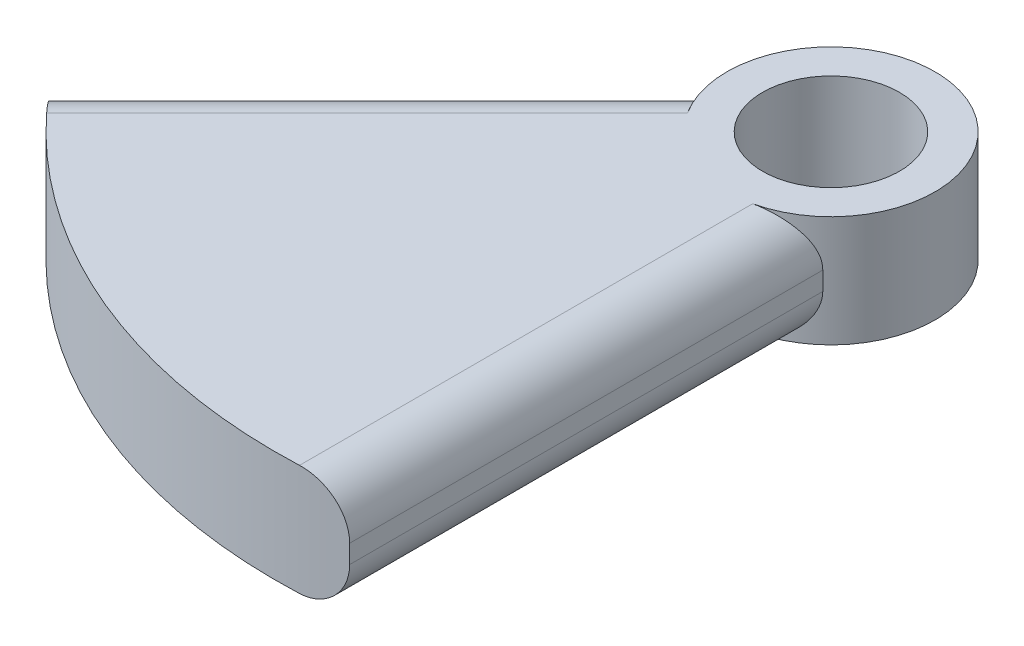
ISO-10303-21;
HEADER;
FILE_DESCRIPTION(('STEP AP214'),'2;1');
FILE_NAME('part.step','',(''),(''),'','','');
FILE_SCHEMA(('AUTOMOTIVE_DESIGN { 1 0 10303 214 1 1 1 1 }'));
ENDSEC;
DATA;
#1=APPLICATION_CONTEXT('core data for automotive mechanical design processes');
#2=APPLICATION_PROTOCOL_DEFINITION('international standard','automotive_design',2000,#1);
#3=PRODUCT_CONTEXT('',#1,'mechanical');
#4=PRODUCT('Part','Part','',(#3));
#5=PRODUCT_RELATED_PRODUCT_CATEGORY('part','',(#4));
#6=PRODUCT_DEFINITION_FORMATION('','',#4);
#7=PRODUCT_DEFINITION_CONTEXT('part definition',#1,'design');
#8=PRODUCT_DEFINITION('design','',#6,#7);
#9=PRODUCT_DEFINITION_SHAPE('','',#8);
#10=(LENGTH_UNIT() NAMED_UNIT(*) SI_UNIT(.MILLI.,.METRE.));
#11=(NAMED_UNIT(*) PLANE_ANGLE_UNIT() SI_UNIT($,.RADIAN.));
#12=(NAMED_UNIT(*) SI_UNIT($,.STERADIAN.) SOLID_ANGLE_UNIT());
#13=UNCERTAINTY_MEASURE_WITH_UNIT(LENGTH_MEASURE(1.E-05),#10,'distance_accuracy_value','');
#14=(GEOMETRIC_REPRESENTATION_CONTEXT(3) GLOBAL_UNCERTAINTY_ASSIGNED_CONTEXT((#13)) GLOBAL_UNIT_ASSIGNED_CONTEXT((#10,
#11,#12)) REPRESENTATION_CONTEXT('',''));
#15=CARTESIAN_POINT('',(0.,0.,0.));
#16=DIRECTION('',(0.,0.,1.));
#17=DIRECTION('',(1.,0.,0.));
#18=AXIS2_PLACEMENT_3D('',#15,#16,#17);
#19=CARTESIAN_POINT('',(-6.73519209080185,15.24,-6.73519209080187));
#20=DIRECTION('',(0.707106781186546,0.,0.707106781186548));
#21=DIRECTION('',(0.707106781186549,0.,-0.707106781186547));
#22=AXIS2_PLACEMENT_3D('',#19,#20,#21);
#23=PLANE('',#22);
#24=DIRECTION('',(0.,-1.,0.));
#25=VECTOR('',#24,1.);
#26=CARTESIAN_POINT('',(-60.1941220043346,15.24,46.7237378227307));
#27=LINE('',#26,#25);
#28=CARTESIAN_POINT('',(-60.1941220043346,8.89,46.7237378227307));
#29=VERTEX_POINT('',#28);
#30=CARTESIAN_POINT('',(-60.1941220043346,6.35,46.7237378227307));
#31=VERTEX_POINT('',#30);
#32=EDGE_CURVE('E159',#29,#31,#27,.T.);
#33=ORIENTED_EDGE('',*,*,#32,.F.);
#34=DIRECTION('',(-0.707106781186549,0.,0.707106781186547));
#35=VECTOR('',#34,1.);
#36=CARTESIAN_POINT('',(-14.2653657690778,8.89,0.794981587474069));
#37=LINE('',#36,#35);
#38=CARTESIAN_POINT('',(-14.2653657690778,8.89,0.794981587474068));
#39=VERTEX_POINT('',#38);
#40=EDGE_CURVE('E116',#29,#39,#37,.F.);
#41=ORIENTED_EDGE('',*,*,#40,.T.);
#42=DIRECTION('',(0.,-1.,0.));
#43=VECTOR('',#42,1.);
#44=CARTESIAN_POINT('',(-14.2653657690778,15.24,0.794981587474068));
#45=LINE('',#44,#43);
#46=CARTESIAN_POINT('',(-14.2653657690778,6.35,0.794981587474068));
#47=VERTEX_POINT('',#46);
#48=EDGE_CURVE('E148',#39,#47,#45,.T.);
#49=ORIENTED_EDGE('',*,*,#48,.T.);
#50=DIRECTION('',(-0.707106781186549,0.,0.707106781186547));
#51=VECTOR('',#50,1.);
#52=CARTESIAN_POINT('',(-6.73519209080185,6.35,-6.73519209080187));
#53=LINE('',#52,#51);
#54=EDGE_CURVE('E121',#47,#31,#53,.T.);
#55=ORIENTED_EDGE('',*,*,#54,.T.);
#56=EDGE_LOOP('',(#33,#41,#49,#55));
#57=FACE_BOUND('',#56,.T.);
#58=ADVANCED_FACE('F41',(#57),#23,.F.);
#59=CARTESIAN_POINT('',(1.31838984174237E-13,15.24,-3.12250225675825E-13));
#60=DIRECTION('',(0.,-1.,0.));
#61=DIRECTION('',(0.,0.,-1.));
#62=AXIS2_PLACEMENT_3D('',#59,#60,#61);
#63=CYLINDRICAL_SURFACE('',#62,76.2000000000003);
#64=CARTESIAN_POINT('',(1.31838984174237E-13,15.24,-3.12250225675825E-13));
#65=DIRECTION('',(0.,1.,0.));
#66=DIRECTION('',(0.,0.,1.));
#67=AXIS2_PLACEMENT_3D('',#64,#65,#66);
#68=CIRCLE('',#67,76.2000000000003);
#69=CARTESIAN_POINT('',(-56.0798082713242,15.24,51.5896802107894));
#70=VERTEX_POINT('',#69);
#71=CARTESIAN_POINT('',(3.17500000000001,15.24,76.1338254325894));
#72=VERTEX_POINT('',#71);
#73=EDGE_CURVE('E129',#70,#72,#68,.T.);
#74=ORIENTED_EDGE('',*,*,#73,.F.);
#75=CARTESIAN_POINT('',(-56.0798082713242,15.24,51.5896802107894));
#76=CARTESIAN_POINT('',(-56.2009597438312,15.2400193976228,51.4579936430628));
#77=CARTESIAN_POINT('',(-56.3216352153093,15.2324504076666,51.325875112836));
#78=CARTESIAN_POINT('',(-56.5611992358236,15.2022901159249,51.0617495608362));
#79=CARTESIAN_POINT('',(-56.6800879153672,15.1796999167964,50.9297425315904));
#80=CARTESIAN_POINT('',(-56.9151528714656,15.119679354057,50.6669172114474));
#81=CARTESIAN_POINT('',(-57.0313315514451,15.0822627140967,50.5360979353652));
#82=CARTESIAN_POINT('',(-57.2603155696502,14.9928753181606,50.276497499669));
#83=CARTESIAN_POINT('',(-57.3731209263728,14.9409046420053,50.1477163288814));
#84=CARTESIAN_POINT('',(-57.5946461849751,14.8227774714894,49.8931379529298));
#85=CARTESIAN_POINT('',(-57.703365367306,14.7566184922883,49.7673412747406));
#86=CARTESIAN_POINT('',(-57.9160515931682,14.6105701875254,49.5196690625934));
#87=CARTESIAN_POINT('',(-58.0200168712637,14.5306758127037,49.3977949902518));
#88=CARTESIAN_POINT('',(-58.2224849332517,14.3577676922412,49.15899459944));
#89=CARTESIAN_POINT('',(-58.3209893263322,14.2647578403441,49.0420668258501));
#90=CARTESIAN_POINT('',(-58.5119829263282,14.0662538475826,48.8140346426404));
#91=CARTESIAN_POINT('',(-58.6044719931194,13.9607594160564,48.7029303686883));
#92=CARTESIAN_POINT('',(-58.7831617320194,13.7376902716403,48.4871074367173));
#93=CARTESIAN_POINT('',(-58.8693426465704,13.6200801670563,48.3824089972888));
#94=CARTESIAN_POINT('',(-59.0346123742067,13.3738681908966,48.1806138968778));
#95=CARTESIAN_POINT('',(-59.1137011712569,13.2452662944698,48.0835172530829));
#96=CARTESIAN_POINT('',(-59.264353968903,12.9779443717861,47.8977103972579));
#97=CARTESIAN_POINT('',(-59.3359164812382,12.8392223535091,47.8090018442524));
#98=CARTESIAN_POINT('',(-59.4710969897202,12.5526589893363,47.6407417390397));
#99=CARTESIAN_POINT('',(-59.5347151864519,12.4048178738281,47.5611899556386));
#100=CARTESIAN_POINT('',(-59.6536429562678,12.101087464692,47.4119393138614));
#101=CARTESIAN_POINT('',(-59.7089544150165,11.9452000084463,47.3422382195499));
#102=CARTESIAN_POINT('',(-59.8109618778689,11.626510094817,47.2132989495842));
#103=CARTESIAN_POINT('',(-59.8576610710136,11.463710224618,47.1540569013918));
#104=CARTESIAN_POINT('',(-59.9421982803066,11.1323487409693,47.046546596674));
#105=CARTESIAN_POINT('',(-59.9800393593732,10.9637891422636,46.9982745471615));
#106=CARTESIAN_POINT('',(-60.0466629441145,10.6221361518407,46.9131237714516));
#107=CARTESIAN_POINT('',(-60.0754477276738,10.44904391208,46.8762421803123));
#108=CARTESIAN_POINT('',(-60.1310485276639,10.0471658377463,46.8049108038433));
#109=CARTESIAN_POINT('',(-60.1547048774195,9.81719629873169,46.7744823373798));
#110=CARTESIAN_POINT('',(-60.1783550206107,9.47038123575287,46.7440447959659));
#111=CARTESIAN_POINT('',(-60.1842660026311,9.35451977757818,46.7364331524534));
#112=CARTESIAN_POINT('',(-60.192148850775,9.12244833652524,46.7262799851714));
#113=CARTESIAN_POINT('',(-60.1941209580183,9.00623837541692,46.7237381510514));
#114=CARTESIAN_POINT('',(-60.1941220043346,8.89,46.7237378227307));
#115=B_SPLINE_CURVE_WITH_KNOTS('',3,(#75,#76,#77,#78,#79,#80,#81,#82,#83,#84,#85,#86,#87,#88,
#89,#90,#91,#92,#93,#94,#95,#96,#97,#98,#99,#100,#101,#102,#103,#104,#105,#106,#107,#108,#109,
#110,#111,#112,#113,#114),.UNSPECIFIED.,.F.,.F.,(4,2,2,2,2,2,2,2,2,2,2,2,2,2,2,2,2,2,2,4),(0.,
0.536648447546683,1.07325750586902,1.60937102402484,2.14548160196476,2.68168614736492,
3.2180882297084,3.75433139811692,4.29058705361406,4.82845617505523,5.36632651257956,
5.90430301034748,6.44226592208945,6.98010652880154,7.51774757654733,8.05520244571623,
8.59252202328639,9.29043338687929,9.63906867957098,9.98768262975453),.UNSPECIFIED.);
#116=EDGE_CURVE('E111',#70,#29,#115,.T.);
#117=ORIENTED_EDGE('',*,*,#116,.T.);
#118=ORIENTED_EDGE('',*,*,#32,.T.);
#119=CARTESIAN_POINT('',(-60.1941220043346,6.35,46.7237378227307));
#120=CARTESIAN_POINT('',(-60.1941309841204,6.1722269928493,46.7237185725701));
#121=CARTESIAN_POINT('',(-60.1895087033319,5.99445761005288,46.7296808932899));
#122=CARTESIAN_POINT('',(-60.1710668079349,5.6402026611297,46.7534291461566));
#123=CARTESIAN_POINT('',(-60.1572478624997,5.46371700254029,46.7712142180494));
#124=CARTESIAN_POINT('',(-60.1204971179359,5.11346387167723,46.8184436642978));
#125=CARTESIAN_POINT('',(-60.0975749055403,4.93969373911274,46.847875772938));
#126=CARTESIAN_POINT('',(-60.042744496835,4.59591618282648,46.9181290150811));
#127=CARTESIAN_POINT('',(-60.0108363640886,4.42590873249798,46.9589500680225));
#128=CARTESIAN_POINT('',(-59.9381992537539,4.09082602670727,47.0516283492346));
#129=CARTESIAN_POINT('',(-59.8974687279105,3.92575164275,47.1034875145725));
#130=CARTESIAN_POINT('',(-59.8073935656179,3.60166425231403,47.2178035245652));
#131=CARTESIAN_POINT('',(-59.7580457601304,3.44265350206283,47.280264267754));
#132=CARTESIAN_POINT('',(-59.651036587918,3.13193475370993,47.415200527569));
#133=CARTESIAN_POINT('',(-59.5933788956521,2.9802235672349,47.4876716172419));
#134=CARTESIAN_POINT('',(-59.470024461757,2.68502754353546,47.6420607536229));
#135=CARTESIAN_POINT('',(-59.4043249147594,2.54154560283035,47.7239820964364));
#136=CARTESIAN_POINT('',(-59.2649570377709,2.26324784415406,47.8969440707208));
#137=CARTESIAN_POINT('',(-59.1912551831422,2.12847257779568,47.9880229387115));
#138=CARTESIAN_POINT('',(-59.0365282557148,1.86920959105832,48.1782456960806));
#139=CARTESIAN_POINT('',(-58.9555031472723,1.74472192075696,48.2773896247131));
#140=CARTESIAN_POINT('',(-58.7865536647992,1.50685177165547,48.4829744594069));
#141=CARTESIAN_POINT('',(-58.6986266834575,1.3934735263656,48.5894181211413));
#142=CARTESIAN_POINT('',(-58.5164358300035,1.17870070479452,48.8086779586693));
#143=CARTESIAN_POINT('',(-58.4221741385495,1.07730203748338,48.9214919394318));
#144=CARTESIAN_POINT('',(-58.2272659789797,0.886591435248749,49.1533168596973));
#145=CARTESIAN_POINT('',(-58.1265852398657,0.797354044784899,49.2723603253524));
#146=CARTESIAN_POINT('',(-57.9199919189212,0.632339953171678,49.515047423479));
#147=CARTESIAN_POINT('',(-57.8140812419092,0.556558396760419,49.6386893771238));
#148=CARTESIAN_POINT('',(-57.5976800873388,0.418980948424143,49.8896249221973));
#149=CARTESIAN_POINT('',(-57.4871909970662,0.357180856170985,50.0169174039467));
#150=CARTESIAN_POINT('',(-57.2623604217276,0.248003272396951,50.2741612081216));
#151=CARTESIAN_POINT('',(-57.1480198581088,0.200622357995364,50.4041118917034));
#152=CARTESIAN_POINT('',(-56.8775753764002,0.107300398566586,50.7093241185317));
#153=CARTESIAN_POINT('',(-56.7202267639635,0.0670769018500863,50.8852839942108));
#154=CARTESIAN_POINT('',(-56.4816360749163,0.0268426948454709,51.1495739849643));
#155=CARTESIAN_POINT('',(-56.4017130074763,0.0167814776547031,51.2376908221128));
#156=CARTESIAN_POINT('',(-56.2412054543675,0.00336097116954585,51.413821199862));
#157=CARTESIAN_POINT('',(-56.1606210149728,1.21694275432921E-06,51.5018347472053));
#158=CARTESIAN_POINT('',(-56.0798082713242,0.,51.5896802107894));
#159=B_SPLINE_CURVE_WITH_KNOTS('',3,(#119,#120,#121,#122,#123,#124,#125,#126,#127,#128,#129,
#130,#131,#132,#133,#134,#135,#136,#137,#138,#139,#140,#141,#142,#143,#144,#145,#146,#147,#148,
#149,#150,#151,#152,#153,#154,#155,#156,#157,#158),.UNSPECIFIED.,.F.,.F.,(4,2,2,2,2,2,2,2,2,2,2,
2,2,2,2,2,2,2,2,4),(0.,0.533153742174724,1.06626869494094,1.59882370199253,2.13137494202839,
2.66401971612176,3.1968607865339,3.72946696448159,4.26225947229214,4.79737709262034,
5.33249731762328,5.86782067624079,6.40296069005885,6.9412460647689,7.47933681377719,
8.01726569362283,8.55506677802506,9.27169546398057,9.6297002406941,9.98768017897878),.UNSPECIFIED.);
#160=CARTESIAN_POINT('',(-56.0798082713242,0.,51.5896802107894));
#161=VERTEX_POINT('',#160);
#162=EDGE_CURVE('E122',#31,#161,#159,.T.);
#163=ORIENTED_EDGE('',*,*,#162,.T.);
#164=CARTESIAN_POINT('',(1.31838984174237E-13,0.,-3.12250225675825E-13));
#165=DIRECTION('',(0.,1.,0.));
#166=DIRECTION('',(0.,0.,1.));
#167=AXIS2_PLACEMENT_3D('',#164,#165,#166);
#168=CIRCLE('',#167,76.2000000000003);
#169=CARTESIAN_POINT('',(3.17500000000001,0.,76.1338254325894));
#170=VERTEX_POINT('',#169);
#171=EDGE_CURVE('E149',#161,#170,#168,.T.);
#172=ORIENTED_EDGE('',*,*,#171,.T.);
#173=CARTESIAN_POINT('',(3.17500000000001,0.,76.1338254325894));
#174=CARTESIAN_POINT('',(3.35378349279112,-1.93976228121325E-05,76.1263759953192));
#175=CARTESIAN_POINT('',(3.53253584563996,0.0075495923334187,76.1182845308805));
#176=CARTESIAN_POINT('',(3.88869815797765,0.0377098840750796,76.1009169054107));
#177=CARTESIAN_POINT('',(4.06610821503325,0.0603000832036467,76.0916408313783));
#178=CARTESIAN_POINT('',(4.41816980565035,0.120320645943,76.0720112897142));
#179=CARTESIAN_POINT('',(4.59282373532083,0.15773728590327,76.0616588249294));
#180=CARTESIAN_POINT('',(4.93830511585674,0.247124681839386,76.0400097485058));
#181=CARTESIAN_POINT('',(5.10913258770253,0.299095357994736,76.0287131420454));
#182=CARTESIAN_POINT('',(5.44578869624316,0.417222528510574,76.0053410586284));
#183=CARTESIAN_POINT('',(5.61161645151271,0.483381507711677,75.9932654455013));
#184=CARTESIAN_POINT('',(5.93713902480562,0.62942981247458,75.9685266173527));
#185=CARTESIAN_POINT('',(6.09683156095847,0.70932418729628,75.9558631874984));
#186=CARTESIAN_POINT('',(6.40885547625688,0.882232307758812,75.9301723514108));
#187=CARTESIAN_POINT('',(6.56118902219522,0.975242159655917,75.9171450541202));
#188=CARTESIAN_POINT('',(6.857484994992,1.17374615241742,75.8909548207643));
#189=CARTESIAN_POINT('',(7.00144722683593,1.27924058394357,75.8777918815476));
#190=CARTESIAN_POINT('',(7.28040981167289,1.5023097283597,75.8515347489199));
#191=CARTESIAN_POINT('',(7.41538189726025,1.61991983294368,75.8384408815083));
#192=CARTESIAN_POINT('',(7.67493592630761,1.86613180910342,75.812613542734));
#193=CARTESIAN_POINT('',(7.79951784627555,1.99473370553016,75.7998800721861));
#194=CARTESIAN_POINT('',(8.03743074884067,2.26205562821386,75.7750223992617));
#195=CARTESIAN_POINT('',(8.15075950597097,2.40077764649094,75.7628983176332));
#196=CARTESIAN_POINT('',(8.36532442160199,2.68734101066366,75.739507510466));
#197=CARTESIAN_POINT('',(8.46656088541619,2.83518212617189,75.7282407632834));
#198=CARTESIAN_POINT('',(8.65619165882157,3.13891253530803,75.7067992548945));
#199=CARTESIAN_POINT('',(8.74458888282385,3.29479999155367,75.6966242460093));
#200=CARTESIAN_POINT('',(8.90789288369236,3.61348990518299,75.6775805825699));
#201=CARTESIAN_POINT('',(8.98280465384914,3.77628977538198,75.6687114447102));
#202=CARTESIAN_POINT('',(9.11860275331625,4.10765125903071,75.6524670131505));
#203=CARTESIAN_POINT('',(9.17949393048366,4.27621085773642,75.6450912032139));
#204=CARTESIAN_POINT('',(9.28681460996899,4.61786384815934,75.6319905008436));
#205=CARTESIAN_POINT('',(9.33324774881435,4.79095608792002,75.6262651932979));
#206=CARTESIAN_POINT('',(9.4230023515393,5.19283416225367,75.6151419959976));
#207=CARTESIAN_POINT('',(9.46124609184705,5.42280370126831,75.6103533863505));
#208=CARTESIAN_POINT('',(9.49949186041001,5.76961876424713,75.6055539710405));
#209=CARTESIAN_POINT('',(9.50905380062382,5.88548022242182,75.604351421767));
#210=CARTESIAN_POINT('',(9.52180718943703,6.11755166347476,75.602746063709));
#211=CARTESIAN_POINT('',(9.52499902798485,6.23376162458309,75.6023432059711));
#212=CARTESIAN_POINT('',(9.52500000000001,6.35,75.6023437136707));
#213=B_SPLINE_CURVE_WITH_KNOTS('',3,(#173,#174,#175,#176,#177,#178,#179,#180,#181,#182,#183,
#184,#185,#186,#187,#188,#189,#190,#191,#192,#193,#194,#195,#196,#197,#198,#199,#200,#201,#202,
#203,#204,#205,#206,#207,#208,#209,#210,#211,#212),.UNSPECIFIED.,.F.,.F.,(4,2,2,2,2,2,2,2,2,2,2,
2,2,2,2,2,2,2,2,4),(0.,0.536648447546683,1.07325750586901,1.60937102402484,2.14548160196476,
2.68168614736491,3.21808822970839,3.75433139811691,4.29058705361405,4.82845617505523,
5.36632651257956,5.90430301034748,6.44226592208946,6.98010652880154,7.51774757654733,
8.05520244571623,8.59252202328639,9.29043338687929,9.63906867957098,9.98768262975453),.UNSPECIFIED.);
#214=CARTESIAN_POINT('',(9.52500000000001,6.35,75.6023437136707));
#215=VERTEX_POINT('',#214);
#216=EDGE_CURVE('E168',#170,#215,#213,.T.);
#217=ORIENTED_EDGE('',*,*,#216,.T.);
#218=DIRECTION('',(0.,-1.,0.));
#219=VECTOR('',#218,1.);
#220=CARTESIAN_POINT('',(9.52500000000001,15.24,75.6023437136707));
#221=LINE('',#220,#219);
#222=CARTESIAN_POINT('',(9.52500000000001,8.89,75.6023437136707));
#223=VERTEX_POINT('',#222);
#224=EDGE_CURVE('E157',#223,#215,#221,.T.);
#225=ORIENTED_EDGE('',*,*,#224,.F.);
#226=CARTESIAN_POINT('',(9.52500000000001,8.89,75.6023437136707));
#227=CARTESIAN_POINT('',(9.52501996158658,9.0677730071507,75.602336451419));
#228=CARTESIAN_POINT('',(9.51753551808388,9.24554238994712,75.6032840027414));
#229=CARTESIAN_POINT('',(9.48770257814736,9.5997973388703,75.6070361640917));
#230=CARTESIAN_POINT('',(9.46535516318198,9.77628299745971,75.6098406390049));
#231=CARTESIAN_POINT('',(9.40597220077333,10.1265361283228,75.6172502000242));
#232=CARTESIAN_POINT('',(9.3689521053445,10.3003062608873,75.6218533918035));
#233=CARTESIAN_POINT('',(9.28050460761402,10.6440838171735,75.6327589819125));
#234=CARTESIAN_POINT('',(9.22907730722397,10.814091267502,75.6390613682225));
#235=CARTESIAN_POINT('',(9.1121816728268,11.1491739732927,75.6532326160528));
#236=CARTESIAN_POINT('',(9.04671087432442,11.31424835725,75.6611017525048));
#237=CARTESIAN_POINT('',(8.90218449038687,11.638335747686,75.6782426202952));
#238=CARTESIAN_POINT('',(8.82312390742323,11.7973464979372,75.6875148674652));
#239=CARTESIAN_POINT('',(8.65204265175956,12.1080652462901,75.7072623004877));
#240=CARTESIAN_POINT('',(8.56002770762313,12.2597764327651,75.7177369542465));
#241=CARTESIAN_POINT('',(8.36363334564987,12.5549724564645,75.7396818028265));
#242=CARTESIAN_POINT('',(8.2592496134197,12.6984543971696,75.751152344651));
#243=CARTESIAN_POINT('',(8.03839905761764,12.9767521558459,75.7749069586567));
#244=CARTESIAN_POINT('',(7.9218814912446,13.1115274222043,75.7871943626417));
#245=CARTESIAN_POINT('',(7.6779652299569,13.3707904089417,75.8122937046973));
#246=CARTESIAN_POINT('',(7.55056648208132,13.495278079243,75.8251056453208));
#247=CARTESIAN_POINT('',(7.28573072662546,13.7331482283445,75.8510107513072));
#248=CARTESIAN_POINT('',(7.14828992684273,13.8465264736344,75.8641040215779));
#249=CARTESIAN_POINT('',(6.86442142093742,14.0612992952055,75.8903157515883));
#250=CARTESIAN_POINT('',(6.71799680889437,14.1626979625166,75.9034342011649));
#251=CARTESIAN_POINT('',(6.4162509543862,14.3534085647512,75.9295382929923));
#252=CARTESIAN_POINT('',(6.26088247920309,14.4426459552151,75.9425227014506));
#253=CARTESIAN_POINT('',(5.94319324822361,14.6076600468283,75.9680448560547));
#254=CARTESIAN_POINT('',(5.780875026447,14.6834416032396,75.9805827620009));
#255=CARTESIAN_POINT('',(5.45041807703146,14.8210190515759,76.0050022637097));
#256=CARTESIAN_POINT('',(5.28228111501344,14.882819143829,76.0168840557699));
#257=CARTESIAN_POINT('',(4.94140305222326,14.991996727603,76.0398036696802));
#258=CARTESIAN_POINT('',(4.76866305474311,15.0393776420046,76.0508416913612));
#259=CARTESIAN_POINT('',(4.36161229250113,15.1326996014334,76.0754261997019));
#260=CARTESIAN_POINT('',(4.12592760032748,15.1729230981499,76.0885863501471));
#261=CARTESIAN_POINT('',(3.77033726151268,15.2131573051545,76.1067585006554));
#262=CARTESIAN_POINT('',(3.65151510546822,15.2232185223453,76.1125523707797));
#263=CARTESIAN_POINT('',(3.41347614175392,15.2366390288305,76.1235993760242));
#264=CARTESIAN_POINT('',(3.29425936203705,15.2399987830572,76.1288525486328));
#265=CARTESIAN_POINT('',(3.17500000000001,15.24,76.1338254325894));
#266=B_SPLINE_CURVE_WITH_KNOTS('',3,(#226,#227,#228,#229,#230,#231,#232,#233,#234,#235,#236,
#237,#238,#239,#240,#241,#242,#243,#244,#245,#246,#247,#248,#249,#250,#251,#252,#253,#254,#255,
#256,#257,#258,#259,#260,#261,#262,#263,#264,#265),.UNSPECIFIED.,.F.,.F.,(4,2,2,2,2,2,2,2,2,2,2,
2,2,2,2,2,2,2,2,4),(0.,0.533153742174724,1.06626869494094,1.59882370199254,2.13137494202839,
2.66401971612176,3.1968607865339,3.72946696448159,4.26225947229214,4.79737709262035,
5.33249731762329,5.86782067624079,6.40296069005884,6.94124606476891,7.47933681377719,
8.01726569362282,8.55506677802505,9.27169546398055,9.62970024069408,9.98768017897878),.UNSPECIFIED.);
#267=EDGE_CURVE('E133',#223,#72,#266,.T.);
#268=ORIENTED_EDGE('',*,*,#267,.T.);
#269=EDGE_LOOP('',(#74,#117,#118,#163,#172,#217,#225,#268));
#270=FACE_BOUND('',#269,.T.);
#271=ADVANCED_FACE('F136',(#270),#63,.T.);
#272=CARTESIAN_POINT('',(9.525,15.24,0.));
#273=DIRECTION('',(1.,0.,0.));
#274=DIRECTION('',(0.,0.,-1.));
#275=AXIS2_PLACEMENT_3D('',#272,#273,#274);
#276=PLANE('',#275);
#277=ORIENTED_EDGE('',*,*,#224,.T.);
#278=DIRECTION('',(0.,0.,1.));
#279=VECTOR('',#278,1.);
#280=CARTESIAN_POINT('',(9.525,6.35,10.6492737428427));
#281=LINE('',#280,#279);
#282=CARTESIAN_POINT('',(9.525,6.35,10.6492737428427));
#283=VERTEX_POINT('',#282);
#284=EDGE_CURVE('E62',#215,#283,#281,.F.);
#285=ORIENTED_EDGE('',*,*,#284,.T.);
#286=DIRECTION('',(0.,-1.,0.));
#287=VECTOR('',#286,1.);
#288=CARTESIAN_POINT('',(9.525,15.24,10.6492737428427));
#289=LINE('',#288,#287);
#290=CARTESIAN_POINT('',(9.525,8.89,10.6492737428427));
#291=VERTEX_POINT('',#290);
#292=EDGE_CURVE('E155',#291,#283,#289,.T.);
#293=ORIENTED_EDGE('',*,*,#292,.F.);
#294=DIRECTION('',(0.,0.,1.));
#295=VECTOR('',#294,1.);
#296=CARTESIAN_POINT('',(9.525,8.89,0.));
#297=LINE('',#296,#295);
#298=EDGE_CURVE('E252',#291,#223,#297,.T.);
#299=ORIENTED_EDGE('',*,*,#298,.T.);
#300=EDGE_LOOP('',(#277,#285,#293,#299));
#301=FACE_BOUND('',#300,.T.);
#302=ADVANCED_FACE('F178',(#301),#276,.T.);
#303=CARTESIAN_POINT('',(0.,15.24,0.));
#304=DIRECTION('',(0.,-1.,0.));
#305=DIRECTION('',(0.,0.,-1.));
#306=AXIS2_PLACEMENT_3D('',#303,#304,#305);
#307=CYLINDRICAL_SURFACE('',#306,14.2875);
#308=CARTESIAN_POINT('',(0.,0.,0.));
#309=DIRECTION('',(0.,1.,0.));
#310=DIRECTION('',(0.,0.,1.));
#311=AXIS2_PLACEMENT_3D('',#308,#309,#310);
#312=CIRCLE('',#311,14.2875);
#313=CARTESIAN_POINT('',(3.175,0.,13.930255964985));
#314=VERTEX_POINT('',#313);
#315=CARTESIAN_POINT('',(-12.0952424867725,0.,7.60511442623794));
#316=VERTEX_POINT('',#315);
#317=EDGE_CURVE('E143',#314,#316,#312,.T.);
#318=ORIENTED_EDGE('',*,*,#317,.T.);
#319=CARTESIAN_POINT('',(-12.0952424867725,0.,7.60511442623794));
#320=CARTESIAN_POINT('',(-12.1946052914386,-2.43342902689872E-05,7.44715150664379));
#321=CARTESIAN_POINT('',(-12.2907884986666,0.00781876892634857,7.28725011988895));
#322=CARTESIAN_POINT('',(-12.4761851381713,0.0386141698449891,6.96503539134375));
#323=CARTESIAN_POINT('',(-12.5654037892139,0.0615550303466238,6.8027239661651));
#324=CARTESIAN_POINT('',(-12.7359235200099,0.121749398279241,6.47784309942922));
#325=CARTESIAN_POINT('',(-12.8172669797964,0.158920264344715,6.31528044755178));
#326=CARTESIAN_POINT('',(-12.9723764461622,0.246876876566653,5.99020275945633));
#327=CARTESIAN_POINT('',(-13.0461411473007,0.297664962868458,5.82768773623355));
#328=CARTESIAN_POINT('',(-13.1857817121705,0.411944778020086,5.50442805650823));
#329=CARTESIAN_POINT('',(-13.2516817258289,0.475395930278238,5.34367943268905));
#330=CARTESIAN_POINT('',(-13.375976862605,0.614427383343733,5.024465199064));
#331=CARTESIAN_POINT('',(-13.4343687493847,0.6900128832423,4.86600059973202));
#332=CARTESIAN_POINT('',(-13.5439159561101,0.852774109928859,4.55221469971493));
#333=CARTESIAN_POINT('',(-13.5950594217318,0.939968380662649,4.39689889613785));
#334=CARTESIAN_POINT('',(-13.6903134171668,1.12527683098266,4.09068344767942));
#335=CARTESIAN_POINT('',(-13.7344233954362,1.22339186591745,3.93978414988334));
#336=CARTESIAN_POINT('',(-13.8202372971594,1.44079204358634,3.62801294916496));
#337=CARTESIAN_POINT('',(-13.8612145712966,1.56121762061923,3.46773477621532));
#338=CARTESIAN_POINT('',(-13.9356762878939,1.8142426171498,3.15521649676144));
#339=CARTESIAN_POINT('',(-13.9691597308522,1.9468436572475,3.00297746455723));
#340=CARTESIAN_POINT('',(-14.0293015321684,2.22375857378736,2.7081338024094));
#341=CARTESIAN_POINT('',(-14.055960789126,2.36807090480328,2.56552790580987));
#342=CARTESIAN_POINT('',(-14.1031985779868,2.66809363209332,2.29166971596494));
#343=CARTESIAN_POINT('',(-14.1237764492099,2.82380526449353,2.16041865740096));
#344=CARTESIAN_POINT('',(-14.1561925818853,3.11528173255267,1.93525633173783));
#345=CARTESIAN_POINT('',(-14.1689500740666,3.24914525934929,1.83901129829899));
#346=CARTESIAN_POINT('',(-14.1914405893298,3.52379988354507,1.65653821819643));
#347=CARTESIAN_POINT('',(-14.2011737296232,3.66459071222531,1.57030978341144));
#348=CARTESIAN_POINT('',(-14.2180328887893,3.95225155553298,1.40950903974866));
#349=CARTESIAN_POINT('',(-14.2251672219627,4.09910047969669,1.33490000369192));
#350=CARTESIAN_POINT('',(-14.2373080890206,4.39866286982922,1.19850169626476));
#351=CARTESIAN_POINT('',(-14.2423158053083,4.55137302530253,1.13670531084302));
#352=CARTESIAN_POINT('',(-14.2499767610254,4.83778525637921,1.03584167073339));
#353=CARTESIAN_POINT('',(-14.2528746612084,4.97076376085096,0.994735937737754));
#354=CARTESIAN_POINT('',(-14.2576661511125,5.23963024198321,0.923515254764918));
#355=CARTESIAN_POINT('',(-14.2595600136785,5.37551741776571,0.893397319574514));
#356=CARTESIAN_POINT('',(-14.2625349429093,5.65054204328898,0.844625972947048));
#357=CARTESIAN_POINT('',(-14.2636089952548,5.78969726751953,0.826071742674611));
#358=CARTESIAN_POINT('',(-14.2650179562505,6.06922562866961,0.801217117051879));
#359=CARTESIAN_POINT('',(-14.2653521872704,6.20959976401383,0.79492795636834));
#360=CARTESIAN_POINT('',(-14.2653657690778,6.35,0.794981587474073));
#361=B_SPLINE_CURVE_WITH_KNOTS('',3,(#319,#320,#321,#322,#323,#324,#325,#326,#327,#328,#329,
#330,#331,#332,#333,#334,#335,#336,#337,#338,#339,#340,#341,#342,#343,#344,#345,#346,#347,#348,
#349,#350,#351,#352,#353,#354,#355,#356,#357,#358,#359,#360),.UNSPECIFIED.,.F.,.F.,(4,2,2,2,2,2,
2,2,2,2,2,2,2,2,2,2,2,2,2,2,4),(0.,0.559568202411894,1.11871299503346,1.67465861869861,
2.23069984398764,2.7849871411645,3.33951256564101,3.89493466659928,4.45040030061385,
5.06360203014562,5.67688549778403,6.29008816750002,6.90335743092969,7.39901855720459,
7.89466047128452,8.38870246650906,8.88246941262195,9.29968571910928,9.71678858987569,
10.1374213946519,10.5584393137445),.UNSPECIFIED.);
#362=EDGE_CURVE('E202',#316,#47,#361,.T.);
#363=ORIENTED_EDGE('',*,*,#362,.T.);
#364=ORIENTED_EDGE('',*,*,#48,.F.);
#365=CARTESIAN_POINT('',(-14.2653657690778,8.89,0.794981587474069));
#366=CARTESIAN_POINT('',(-14.265346644756,9.04329224609793,0.794907667415692));
#367=CARTESIAN_POINT('',(-14.2649511660111,9.19654200099966,0.802414768056198));
#368=CARTESIAN_POINT('',(-14.2632674136647,9.50145626175112,0.832017635800966));
#369=CARTESIAN_POINT('',(-14.2619801292766,9.65312233523615,0.854097237435928));
#370=CARTESIAN_POINT('',(-14.2583899391984,9.9523243902734,0.912005030961723));
#371=CARTESIAN_POINT('',(-14.2560965364668,10.0998855961046,0.947704182112406));
#372=CARTESIAN_POINT('',(-14.2502501446558,10.3912708367543,1.03189779425558));
#373=CARTESIAN_POINT('',(-14.2466968700186,10.5350940163874,1.08039515540417));
#374=CARTESIAN_POINT('',(-14.2337427786835,10.9583927550829,1.24298865539872));
#375=CARTESIAN_POINT('',(-14.2220351128158,11.2312466549553,1.37450421166789));
#376=CARTESIAN_POINT('',(-14.1897632587451,11.7551659298761,1.67514133979174));
#377=CARTESIAN_POINT('',(-14.1691769969827,12.006175113995,1.84435612750272));
#378=CARTESIAN_POINT('',(-14.1128478715978,12.5164162674823,2.23710373475809));
#379=CARTESIAN_POINT('',(-14.0754337789981,12.7721819804847,2.46488579384515));
#380=CARTESIAN_POINT('',(-13.9819595619365,13.2511030492092,2.94929040342515));
#381=CARTESIAN_POINT('',(-13.925888114585,13.4742384834055,3.205930404631));
#382=CARTESIAN_POINT('',(-13.8183814641402,13.8044370979752,3.6349602026201));
#383=CARTESIAN_POINT('',(-13.7738307239646,13.9225837605973,3.80068441662386));
#384=CARTESIAN_POINT('',(-13.6761094552708,14.1455060835148,4.13854786031776));
#385=CARTESIAN_POINT('',(-13.6229377858755,14.2502799707988,4.31068793674547));
#386=CARTESIAN_POINT('',(-13.5075498601544,14.4455311146022,4.65966685657425));
#387=CARTESIAN_POINT('',(-13.4453451146125,14.5360262646897,4.83649948935647));
#388=CARTESIAN_POINT('',(-13.3114753954458,14.701994986879,5.19361422855684));
#389=CARTESIAN_POINT('',(-13.239810998141,14.7774694733983,5.37389612426033));
#390=CARTESIAN_POINT('',(-13.0912469944305,14.9085280187187,5.72592993767542));
#391=CARTESIAN_POINT('',(-13.0148860446768,14.9650068146577,5.89757564548445));
#392=CARTESIAN_POINT('',(-12.8536675049544,15.0628813608722,6.24114596121989));
#393=CARTESIAN_POINT('',(-12.7688119813074,15.1042807679279,6.41307049135993));
#394=CARTESIAN_POINT('',(-12.5903782229891,15.171340176607,6.75667123677476));
#395=CARTESIAN_POINT('',(-12.4967564129802,15.1969161575398,6.92834137823347));
#396=CARTESIAN_POINT('',(-12.3016959178163,15.2312686828327,7.26910161832616));
#397=CARTESIAN_POINT('',(-12.2002500246579,15.2400295390891,7.43818916172635));
#398=CARTESIAN_POINT('',(-12.0952424867725,15.24,7.60511442623793));
#399=B_SPLINE_CURVE_WITH_KNOTS('',3,(#365,#366,#367,#368,#369,#370,#371,#372,#373,#374,#375,
#376,#377,#378,#379,#380,#381,#382,#383,#384,#385,#386,#387,#388,#389,#390,#391,#392,#393,#394,
#395,#396,#397,#398),.UNSPECIFIED.,.F.,.F.,(4,2,2,2,2,2,2,2,2,2,2,2,2,2,2,2,4),(0.,
0.459623837942286,0.918738664093942,1.37360742093726,1.82857934258849,2.73384045160397,
3.64136527175216,4.67143169469631,5.70212439430992,6.32654605678423,6.95105042156087,
7.57476585684126,8.19844331039135,8.78622730755319,9.37386867093775,9.96460415210627,
10.5558905077598),.UNSPECIFIED.);
#400=CARTESIAN_POINT('',(-12.0952424867725,15.24,7.60511442623793));
#401=VERTEX_POINT('',#400);
#402=EDGE_CURVE('E208',#39,#401,#399,.T.);
#403=ORIENTED_EDGE('',*,*,#402,.T.);
#404=CARTESIAN_POINT('',(0.,15.24,0.));
#405=DIRECTION('',(0.,1.,0.));
#406=DIRECTION('',(0.,0.,1.));
#407=AXIS2_PLACEMENT_3D('',#404,#405,#406);
#408=CIRCLE('',#407,14.2875);
#409=CARTESIAN_POINT('',(3.175,15.24,13.930255964985));
#410=VERTEX_POINT('',#409);
#411=EDGE_CURVE('E131',#410,#401,#408,.T.);
#412=ORIENTED_EDGE('',*,*,#411,.F.);
#413=CARTESIAN_POINT('',(3.175,15.24,13.930255964985));
#414=CARTESIAN_POINT('',(3.35695676459814,15.2400243342903,13.888819426341));
#415=CARTESIAN_POINT('',(3.53803591756083,15.2321812310736,13.8437638695128));
#416=CARTESIAN_POINT('',(3.89697135811625,15.201385830155,13.7470188709632));
#417=CARTESIAN_POINT('',(4.07482998068468,15.1784449696534,13.6953344747159));
#418=CARTESIAN_POINT('',(4.42513110260334,15.1182506017208,13.5861846687411));
#419=CARTESIAN_POINT('',(4.59759876813374,15.0810797356553,13.5287540272511));
#420=CARTESIAN_POINT('',(4.93714236129195,14.9931231234333,13.4085683450799));
#421=CARTESIAN_POINT('',(5.1042173566447,14.9423350371315,13.3458123905016));
#422=CARTESIAN_POINT('',(5.43153725861085,14.8280552219799,13.2159740692318));
#423=CARTESIAN_POINT('',(5.59180204711794,14.7646040697218,13.148905973801));
#424=CARTESIAN_POINT('',(5.90541053044836,14.6255726166563,13.0110773586363));
#425=CARTESIAN_POINT('',(6.05875122232223,14.5499871167577,12.9403152649789));
#426=CARTESIAN_POINT('',(6.35809293280061,14.3872258900711,12.7958966999716));
#427=CARTESIAN_POINT('',(6.50408168208988,14.3000316193374,12.7222357333913));
#428=CARTESIAN_POINT('',(6.78796344830613,14.1147231690173,12.5730634593895));
#429=CARTESIAN_POINT('',(6.9258558298063,14.0166081340825,12.4975520073939));
#430=CARTESIAN_POINT('',(7.20699095184151,13.7992079564137,12.3377760690158));
#431=CARTESIAN_POINT('',(7.34930004322731,13.6787823793808,12.2534175944639));
#432=CARTESIAN_POINT('',(7.62293622261868,13.4257573828502,12.0850861845621));
#433=CARTESIAN_POINT('',(7.75426184422479,13.2931563427525,12.0011133021024));
#434=CARTESIAN_POINT('',(8.00527447266291,13.0162414262126,11.8351540247513));
#435=CARTESIAN_POINT('',(8.12496301056171,12.8719290951967,11.7531673696047));
#436=CARTESIAN_POINT('',(8.35201215451629,12.5719063679067,11.5929225473136));
#437=CARTESIAN_POINT('',(8.459371420349,12.4161947355065,11.5146647860493));
#438=CARTESIAN_POINT('',(8.64150689492779,12.1247182674473,11.3783726459399));
#439=CARTESIAN_POINT('',(8.71858331996022,11.9908547406507,11.319338039372));
#440=CARTESIAN_POINT('',(8.86351446813971,11.7162001164549,11.2062132829025));
#441=CARTESIAN_POINT('',(8.93136954861101,11.5754092877747,11.1521229414387));
#442=CARTESIAN_POINT('',(9.05699407064623,11.287748444467,11.0503408709463));
#443=CARTESIAN_POINT('',(9.11479536134591,11.1408995203033,11.0026290509789));
#444=CARTESIAN_POINT('',(9.21982841889614,10.8413371301708,10.9147657722809));
#445=CARTESIAN_POINT('',(9.26706605222594,10.6886269746975,10.8746101192417));
#446=CARTESIAN_POINT('',(9.34380452986057,10.4022147436208,10.8087058690829));
#447=CARTESIAN_POINT('',(9.37491979727802,10.269236239149,10.7816888514067));
#448=CARTESIAN_POINT('',(9.42866852017206,10.0003697580168,10.7347163185191));
#449=CARTESIAN_POINT('',(9.45130427944357,9.86448258223428,10.7147588853736));
#450=CARTESIAN_POINT('',(9.48789442200409,9.58945795671102,10.6823759280784));
#451=CARTESIAN_POINT('',(9.50177371374631,9.45030273248047,10.6700155757299));
#452=CARTESIAN_POINT('',(9.52034487394247,9.17077437133039,10.6534369872827));
#453=CARTESIAN_POINT('',(9.5250283191304,9.03040023598617,10.6492262161361));
#454=CARTESIAN_POINT('',(9.525,8.89,10.6492737428427));
#455=B_SPLINE_CURVE_WITH_KNOTS('',3,(#413,#414,#415,#416,#417,#418,#419,#420,#421,#422,#423,
#424,#425,#426,#427,#428,#429,#430,#431,#432,#433,#434,#435,#436,#437,#438,#439,#440,#441,#442,
#443,#444,#445,#446,#447,#448,#449,#450,#451,#452,#453,#454),.UNSPECIFIED.,.F.,.F.,(4,2,2,2,2,2,
2,2,2,2,2,2,2,2,2,2,2,2,2,2,4),(0.,0.559568202411893,1.11871299503346,1.67465861869861,
2.23069984398764,2.7849871411645,3.33951256564101,3.89493466659928,4.45040030061385,
5.06360203014562,5.67688549778403,6.29008816750002,6.9033574309297,7.39901855720459,
7.89466047128452,8.38870246650906,8.88246941262196,9.29968571910929,9.7167885898757,
10.1374213946519,10.5584393137445),.UNSPECIFIED.);
#456=EDGE_CURVE('E11',#410,#291,#455,.T.);
#457=ORIENTED_EDGE('',*,*,#456,.T.);
#458=ORIENTED_EDGE('',*,*,#292,.T.);
#459=CARTESIAN_POINT('',(9.525,6.35,10.6492737428427));
#460=CARTESIAN_POINT('',(9.52503874643692,6.19670775390207,10.6492079505306));
#461=CARTESIAN_POINT('',(9.5194507789646,6.04345799900034,10.6542366265982));
#462=CARTESIAN_POINT('',(9.49732779773775,5.73854373824888,10.6739784224211));
#463=CARTESIAN_POINT('',(9.48080491417565,5.58687766476385,10.688680810943));
#464=CARTESIAN_POINT('',(9.43731927293995,5.28767560972659,10.7270891566785));
#465=CARTESIAN_POINT('',(9.41045448045517,5.14011440389543,10.7507105879163));
#466=CARTESIAN_POINT('',(9.34678658308111,4.84872916324571,10.8061104387003));
#467=CARTESIAN_POINT('',(9.30998122555192,4.70490598361263,10.8378907070467));
#468=CARTESIAN_POINT('',(9.18585033330177,4.28160724491714,10.9437017476426));
#469=CARTESIAN_POINT('',(9.08457622170541,4.0087533450447,11.0284187193851));
#470=CARTESIAN_POINT('',(8.84917402287774,3.48483407012385,11.2181816245031));
#471=CARTESIAN_POINT('',(8.71496441371875,3.23382488600498,11.323277863079));
#472=CARTESIAN_POINT('',(8.3974192107957,2.72358373251767,11.5611616529261));
#473=CARTESIAN_POINT('',(8.20989721359344,2.46781801951528,11.6957721329501));
#474=CARTESIAN_POINT('',(7.80127517657106,1.98889695079077,11.9722016644717));
#475=CARTESIAN_POINT('',(7.58015479074144,1.7657615165945,12.1140250489949));
#476=CARTESIAN_POINT('',(7.20076622970011,1.43556290202481,12.3413762469319));
#477=CARTESIAN_POINT('',(7.05207938368622,1.31741623940272,12.4270588319758));
#478=CARTESIAN_POINT('',(6.74407447977568,1.09449391648516,12.5968649923672));
#479=CARTESIAN_POINT('',(6.58475501642325,0.989720029201233,12.6809883597268));
#480=CARTESIAN_POINT('',(6.25639807097675,0.794468885397753,12.8461621356845));
#481=CARTESIAN_POINT('',(6.08737311980667,0.703973735310331,12.9272162920652));
#482=CARTESIAN_POINT('',(5.74019467983809,0.538005013120999,13.0850743595971));
#483=CARTESIAN_POINT('',(5.56204174755714,0.462530526601741,13.1618785292703));
#484=CARTESIAN_POINT('',(5.20806563642042,0.331471981281286,13.3057534114791));
#485=CARTESIAN_POINT('',(5.03269844707845,0.27499318534227,13.3731299100438));
#486=CARTESIAN_POINT('',(4.6757588243168,0.177118639127803,13.502072087424));
#487=CARTESIAN_POINT('',(4.49418790701055,0.135719232072071,13.5636391723465));
#488=CARTESIAN_POINT('',(4.12505376940748,0.0686598233930221,13.6804298689506));
#489=CARTESIAN_POINT('',(3.93746403153055,0.0430838424601596,13.735618373379));
#490=CARTESIAN_POINT('',(3.55858155613019,0.00873131716726933,13.8386436510353));
#491=CARTESIAN_POINT('',(3.36728552860194,-2.95390891506778E-05,13.8864735206119));
#492=CARTESIAN_POINT('',(3.175,0.,13.930255964985));
#493=B_SPLINE_CURVE_WITH_KNOTS('',3,(#459,#460,#461,#462,#463,#464,#465,#466,#467,#468,#469,
#470,#471,#472,#473,#474,#475,#476,#477,#478,#479,#480,#481,#482,#483,#484,#485,#486,#487,#488,
#489,#490,#491,#492),.UNSPECIFIED.,.F.,.F.,(4,2,2,2,2,2,2,2,2,2,2,2,2,2,2,2,4),(0.,
0.459623837942287,0.918738664093942,1.37360742093726,1.82857934258849,2.73384045160397,
3.64136527175217,4.67143169469631,5.70212439430991,6.32654605678423,6.95105042156086,
7.57476585684126,8.19844331039135,8.78622730755319,9.37386867093775,9.96460415210627,
10.5558905077598),.UNSPECIFIED.);
#494=EDGE_CURVE('E55',#283,#314,#493,.T.);
#495=ORIENTED_EDGE('',*,*,#494,.T.);
#496=EDGE_LOOP('',(#318,#363,#364,#403,#412,#457,#458,#495));
#497=FACE_BOUND('',#496,.T.);
#498=ADVANCED_FACE('F218',(#497),#307,.T.);
#499=CARTESIAN_POINT('',(0.,15.24,0.));
#500=DIRECTION('',(0.,-1.,0.));
#501=DIRECTION('',(0.,0.,-1.));
#502=AXIS2_PLACEMENT_3D('',#499,#500,#501);
#503=CYLINDRICAL_SURFACE('',#502,9.398);
#504=CARTESIAN_POINT('',(0.,15.24,0.));
#505=DIRECTION('',(0.,1.,0.));
#506=DIRECTION('',(0.,0.,1.));
#507=AXIS2_PLACEMENT_3D('',#504,#505,#506);
#508=CIRCLE('',#507,9.398);
#509=CARTESIAN_POINT('',(0.,15.24,-9.398));
#510=VERTEX_POINT('',#509);
#511=EDGE_CURVE('E140',#510,#510,#508,.T.);
#512=CARTESIAN_POINT('',(0.,0.,0.));
#513=DIRECTION('',(0.,1.,0.));
#514=DIRECTION('',(0.,0.,1.));
#515=AXIS2_PLACEMENT_3D('',#512,#513,#514);
#516=CIRCLE('',#515,9.398);
#517=CARTESIAN_POINT('',(0.,0.,-9.398));
#518=VERTEX_POINT('',#517);
#519=EDGE_CURVE('E138',#518,#518,#516,.T.);
#520=CARTESIAN_POINT('',(0.,15.24,-9.398));
#521=CARTESIAN_POINT('',(0.,15.08125,-9.398));
#522=CARTESIAN_POINT('',(0.,14.9225,-9.398));
#523=CARTESIAN_POINT('',(0.,14.605,-9.398));
#524=CARTESIAN_POINT('',(0.,14.44625,-9.398));
#525=CARTESIAN_POINT('',(0.,14.12875,-9.398));
#526=CARTESIAN_POINT('',(0.,13.97,-9.398));
#527=CARTESIAN_POINT('',(0.,13.6525,-9.398));
#528=CARTESIAN_POINT('',(0.,13.49375,-9.398));
#529=CARTESIAN_POINT('',(0.,13.17625,-9.398));
#530=CARTESIAN_POINT('',(0.,13.0175,-9.398));
#531=CARTESIAN_POINT('',(0.,12.7,-9.398));
#532=CARTESIAN_POINT('',(0.,12.54125,-9.398));
#533=CARTESIAN_POINT('',(0.,12.22375,-9.398));
#534=CARTESIAN_POINT('',(0.,12.065,-9.398));
#535=CARTESIAN_POINT('',(0.,11.7475,-9.398));
#536=CARTESIAN_POINT('',(0.,11.58875,-9.398));
#537=CARTESIAN_POINT('',(0.,11.27125,-9.398));
#538=CARTESIAN_POINT('',(0.,11.1125,-9.398));
#539=CARTESIAN_POINT('',(0.,10.795,-9.398));
#540=CARTESIAN_POINT('',(0.,10.63625,-9.398));
#541=CARTESIAN_POINT('',(0.,10.31875,-9.398));
#542=CARTESIAN_POINT('',(0.,10.16,-9.398));
#543=CARTESIAN_POINT('',(0.,9.8425,-9.398));
#544=CARTESIAN_POINT('',(0.,9.68375,-9.398));
#545=CARTESIAN_POINT('',(0.,9.36625,-9.398));
#546=CARTESIAN_POINT('',(0.,9.2075,-9.398));
#547=CARTESIAN_POINT('',(0.,8.89,-9.398));
#548=CARTESIAN_POINT('',(0.,8.73125,-9.398));
#549=CARTESIAN_POINT('',(0.,8.41375,-9.398));
#550=CARTESIAN_POINT('',(0.,8.255,-9.398));
#551=CARTESIAN_POINT('',(0.,7.9375,-9.398));
#552=CARTESIAN_POINT('',(0.,7.77875,-9.398));
#553=CARTESIAN_POINT('',(0.,7.46125,-9.398));
#554=CARTESIAN_POINT('',(0.,7.3025,-9.398));
#555=CARTESIAN_POINT('',(0.,6.985,-9.398));
#556=CARTESIAN_POINT('',(0.,6.82625,-9.398));
#557=CARTESIAN_POINT('',(0.,6.50875,-9.398));
#558=CARTESIAN_POINT('',(0.,6.35,-9.398));
#559=CARTESIAN_POINT('',(0.,6.0325,-9.398));
#560=CARTESIAN_POINT('',(0.,5.87375,-9.398));
#561=CARTESIAN_POINT('',(0.,5.55625,-9.398));
#562=CARTESIAN_POINT('',(0.,5.3975,-9.398));
#563=CARTESIAN_POINT('',(0.,5.08,-9.398));
#564=CARTESIAN_POINT('',(0.,4.92125,-9.398));
#565=CARTESIAN_POINT('',(0.,4.60375,-9.398));
#566=CARTESIAN_POINT('',(0.,4.445,-9.398));
#567=CARTESIAN_POINT('',(0.,4.1275,-9.398));
#568=CARTESIAN_POINT('',(0.,3.96875,-9.398));
#569=CARTESIAN_POINT('',(0.,3.65125,-9.398));
#570=CARTESIAN_POINT('',(0.,3.4925,-9.398));
#571=CARTESIAN_POINT('',(0.,3.175,-9.398));
#572=CARTESIAN_POINT('',(0.,3.01625,-9.398));
#573=CARTESIAN_POINT('',(0.,2.69875,-9.398));
#574=CARTESIAN_POINT('',(0.,2.54,-9.398));
#575=CARTESIAN_POINT('',(0.,2.2225,-9.398));
#576=CARTESIAN_POINT('',(0.,2.06375,-9.398));
#577=CARTESIAN_POINT('',(0.,1.74625,-9.398));
#578=CARTESIAN_POINT('',(0.,1.5875,-9.398));
#579=CARTESIAN_POINT('',(0.,1.27,-9.398));
#580=CARTESIAN_POINT('',(0.,1.11125,-9.398));
#581=CARTESIAN_POINT('',(0.,0.79375,-9.398));
#582=CARTESIAN_POINT('',(0.,0.634999999999999,-9.398));
#583=CARTESIAN_POINT('',(0.,0.3175,-9.398));
#584=CARTESIAN_POINT('',(0.,0.15875,-9.398));
#585=CARTESIAN_POINT('',(0.,0.,-9.398));
#586=B_SPLINE_CURVE_WITH_KNOTS('',3,(#520,#521,#522,#523,#524,#525,#526,#527,#528,#529,#530,
#531,#532,#533,#534,#535,#536,#537,#538,#539,#540,#541,#542,#543,#544,#545,#546,#547,#548,#549,
#550,#551,#552,#553,#554,#555,#556,#557,#558,#559,#560,#561,#562,#563,#564,#565,#566,#567,#568,
#569,#570,#571,#572,#573,#574,#575,#576,#577,#578,#579,#580,#581,#582,#583,#584,#585),
.UNSPECIFIED.,.F.,.F.,(4,2,2,2,2,2,2,2,2,2,2,2,2,2,2,2,2,2,2,2,2,2,2,2,2,2,2,2,2,2,2,2,4),(0.,
0.476249999999999,0.952499999999998,1.42875,1.905,2.38125,2.8575,3.33375,3.81,4.28625,4.7625,
5.23875,5.715,6.19125,6.6675,7.14375,7.62,8.09625,8.5725,9.04875,9.525,10.00125,10.4775,
10.95375,11.43,11.90625,12.3825,12.85875,13.335,13.81125,14.2875,14.76375,15.24),.UNSPECIFIED.);
#587=EDGE_CURVE('BSEAM222',#510,#518,#586,.T.);
#588=ORIENTED_EDGE('',*,*,#511,.T.);
#589=ORIENTED_EDGE('',*,*,#519,.F.);
#590=ORIENTED_EDGE('',*,*,#587,.T.);
#591=ORIENTED_EDGE('',*,*,#587,.F.);
#592=EDGE_LOOP('',(#588,#590,#589,#591));
#593=FACE_BOUND('',#592,.T.);
#594=ADVANCED_FACE('F222',(#593),#503,.F.);
#595=CARTESIAN_POINT('',(0.,15.24,0.));
#596=DIRECTION('',(0.,1.,0.));
#597=DIRECTION('',(0.,0.,1.));
#598=AXIS2_PLACEMENT_3D('',#595,#596,#597);
#599=PLANE('',#598);
#600=ORIENTED_EDGE('',*,*,#411,.T.);
#601=DIRECTION('',(-0.707106781186549,0.,0.707106781186547));
#602=VECTOR('',#601,1.);
#603=CARTESIAN_POINT('',(-55.7039939438001,15.24,51.2138658832653));
#604=LINE('',#603,#602);
#605=EDGE_CURVE('E115',#401,#70,#604,.T.);
#606=ORIENTED_EDGE('',*,*,#605,.T.);
#607=ORIENTED_EDGE('',*,*,#73,.T.);
#608=DIRECTION('',(0.,0.,1.));
#609=VECTOR('',#608,1.);
#610=CARTESIAN_POINT('',(3.175,15.24,0.));
#611=LINE('',#610,#609);
#612=EDGE_CURVE('E134',#72,#410,#611,.F.);
#613=ORIENTED_EDGE('',*,*,#612,.T.);
#614=EDGE_LOOP('',(#600,#606,#607,#613));
#615=FACE_BOUND('',#614,.T.);
#616=ORIENTED_EDGE('',*,*,#511,.F.);
#617=EDGE_LOOP('',(#616));
#618=FACE_BOUND('',#617,.T.);
#619=ADVANCED_FACE('F126',(#615,#618),#599,.T.);
#620=CARTESIAN_POINT('',(0.,0.,0.));
#621=DIRECTION('',(0.,1.,0.));
#622=DIRECTION('',(0.,0.,1.));
#623=AXIS2_PLACEMENT_3D('',#620,#621,#622);
#624=PLANE('',#623);
#625=ORIENTED_EDGE('',*,*,#171,.F.);
#626=DIRECTION('',(-0.707106781186549,0.,0.707106781186547));
#627=VECTOR('',#626,1.);
#628=CARTESIAN_POINT('',(-2.24506403026728,0.,-2.24506403026729));
#629=LINE('',#628,#627);
#630=EDGE_CURVE('E248',#161,#316,#629,.F.);
#631=ORIENTED_EDGE('',*,*,#630,.T.);
#632=ORIENTED_EDGE('',*,*,#317,.F.);
#633=DIRECTION('',(0.,0.,1.));
#634=VECTOR('',#633,1.);
#635=CARTESIAN_POINT('',(3.17500000000001,0.,75.6023437136707));
#636=LINE('',#635,#634);
#637=EDGE_CURVE('E251',#314,#170,#636,.T.);
#638=ORIENTED_EDGE('',*,*,#637,.T.);
#639=EDGE_LOOP('',(#625,#631,#632,#638));
#640=FACE_BOUND('',#639,.T.);
#641=ORIENTED_EDGE('',*,*,#519,.T.);
#642=EDGE_LOOP('',(#641));
#643=FACE_BOUND('',#642,.T.);
#644=ADVANCED_FACE('F229',(#640,#643),#624,.F.);
#645=CARTESIAN_POINT('',(-2.24506403026728,8.89,-2.24506403026729));
#646=DIRECTION('',(0.707106781186549,0.,-0.707106781186547));
#647=DIRECTION('',(-0.707106781186547,0.,-0.707106781186549));
#648=AXIS2_PLACEMENT_3D('',#645,#646,#647);
#649=CYLINDRICAL_SURFACE('',#648,6.35);
#650=ORIENTED_EDGE('',*,*,#402,.F.);
#651=ORIENTED_EDGE('',*,*,#40,.F.);
#652=ORIENTED_EDGE('',*,*,#116,.F.);
#653=ORIENTED_EDGE('',*,*,#605,.F.);
#654=EDGE_LOOP('',(#650,#651,#652,#653));
#655=FACE_BOUND('',#654,.T.);
#656=ADVANCED_FACE('F114',(#655),#649,.T.);
#657=CARTESIAN_POINT('',(-2.24506403026728,6.35,-2.24506403026729));
#658=DIRECTION('',(-0.707106781186549,0.,0.707106781186547));
#659=DIRECTION('',(0.707106781186547,0.,0.707106781186549));
#660=AXIS2_PLACEMENT_3D('',#657,#658,#659);
#661=CYLINDRICAL_SURFACE('',#660,6.35);
#662=ORIENTED_EDGE('',*,*,#362,.F.);
#663=ORIENTED_EDGE('',*,*,#630,.F.);
#664=ORIENTED_EDGE('',*,*,#162,.F.);
#665=ORIENTED_EDGE('',*,*,#54,.F.);
#666=EDGE_LOOP('',(#662,#663,#664,#665));
#667=FACE_BOUND('',#666,.T.);
#668=ADVANCED_FACE('F193',(#667),#661,.T.);
#669=CARTESIAN_POINT('',(3.175,6.35,0.));
#670=DIRECTION('',(0.,0.,-1.));
#671=DIRECTION('',(-1.,0.,0.));
#672=AXIS2_PLACEMENT_3D('',#669,#670,#671);
#673=CYLINDRICAL_SURFACE('',#672,6.35);
#674=ORIENTED_EDGE('',*,*,#494,.F.);
#675=ORIENTED_EDGE('',*,*,#284,.F.);
#676=ORIENTED_EDGE('',*,*,#216,.F.);
#677=ORIENTED_EDGE('',*,*,#637,.F.);
#678=EDGE_LOOP('',(#674,#675,#676,#677));
#679=FACE_BOUND('',#678,.T.);
#680=ADVANCED_FACE('F196',(#679),#673,.T.);
#681=CARTESIAN_POINT('',(3.175,8.89,0.));
#682=DIRECTION('',(0.,0.,1.));
#683=DIRECTION('',(1.,0.,0.));
#684=AXIS2_PLACEMENT_3D('',#681,#682,#683);
#685=CYLINDRICAL_SURFACE('',#684,6.35);
#686=ORIENTED_EDGE('',*,*,#456,.F.);
#687=ORIENTED_EDGE('',*,*,#612,.F.);
#688=ORIENTED_EDGE('',*,*,#267,.F.);
#689=ORIENTED_EDGE('',*,*,#298,.F.);
#690=EDGE_LOOP('',(#686,#687,#688,#689));
#691=FACE_BOUND('',#690,.T.);
#692=ADVANCED_FACE('F43',(#691),#685,.T.);
#693=CLOSED_SHELL('',(#58,#271,#302,#498,#594,#619,#644,#656,#668,#680,#692));
#694=MANIFOLD_SOLID_BREP('B2',#693);
#695=ADVANCED_BREP_SHAPE_REPRESENTATION('',(#18,#694),#14);
#696=SHAPE_DEFINITION_REPRESENTATION(#9,#695);
ENDSEC;
END-ISO-10303-21;
